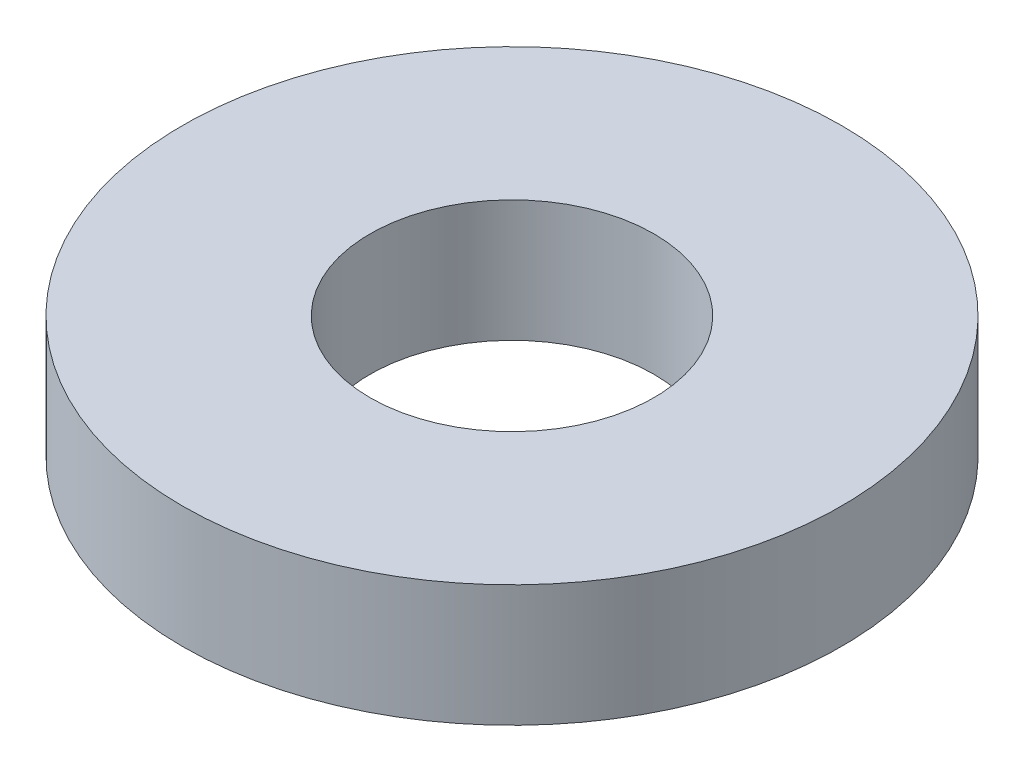
ISO-10303-21;
HEADER;
FILE_DESCRIPTION(('STEP AP214'),'2;1');
FILE_NAME('part.step','',(''),(''),'','','');
FILE_SCHEMA(('AUTOMOTIVE_DESIGN { 1 0 10303 214 1 1 1 1 }'));
ENDSEC;
DATA;
#1=APPLICATION_CONTEXT('core data for automotive mechanical design processes');
#2=APPLICATION_PROTOCOL_DEFINITION('international standard','automotive_design',2000,#1);
#3=PRODUCT_CONTEXT('',#1,'mechanical');
#4=PRODUCT('Part','Part','',(#3));
#5=PRODUCT_RELATED_PRODUCT_CATEGORY('part','',(#4));
#6=PRODUCT_DEFINITION_FORMATION('','',#4);
#7=PRODUCT_DEFINITION_CONTEXT('part definition',#1,'design');
#8=PRODUCT_DEFINITION('design','',#6,#7);
#9=PRODUCT_DEFINITION_SHAPE('','',#8);
#10=(LENGTH_UNIT() NAMED_UNIT(*) SI_UNIT(.MILLI.,.METRE.));
#11=(NAMED_UNIT(*) PLANE_ANGLE_UNIT() SI_UNIT($,.RADIAN.));
#12=(NAMED_UNIT(*) SI_UNIT($,.STERADIAN.) SOLID_ANGLE_UNIT());
#13=UNCERTAINTY_MEASURE_WITH_UNIT(LENGTH_MEASURE(1.E-05),#10,'distance_accuracy_value','');
#14=(GEOMETRIC_REPRESENTATION_CONTEXT(3) GLOBAL_UNCERTAINTY_ASSIGNED_CONTEXT((#13)) GLOBAL_UNIT_ASSIGNED_CONTEXT((#10,
#11,#12)) REPRESENTATION_CONTEXT('',''));
#15=CARTESIAN_POINT('',(0.,0.,0.));
#16=DIRECTION('',(0.,0.,1.));
#17=DIRECTION('',(1.,0.,0.));
#18=AXIS2_PLACEMENT_3D('',#15,#16,#17);
#19=CARTESIAN_POINT('',(0.,12.,0.));
#20=DIRECTION('',(0.,1.,0.));
#21=DIRECTION('',(0.,0.,1.));
#22=AXIS2_PLACEMENT_3D('',#19,#20,#21);
#23=PLANE('',#22);
#24=CARTESIAN_POINT('',(0.,12.,0.));
#25=DIRECTION('',(0.,1.,0.));
#26=DIRECTION('',(0.,0.,1.));
#27=AXIS2_PLACEMENT_3D('',#24,#25,#26);
#28=CIRCLE('',#27,32.5);
#29=CARTESIAN_POINT('',(0.,12.,32.5));
#30=VERTEX_POINT('',#29);
#31=EDGE_CURVE('E10',#30,#30,#28,.T.);
#32=ORIENTED_EDGE('',*,*,#31,.T.);
#33=EDGE_LOOP('',(#32));
#34=FACE_BOUND('',#33,.T.);
#35=CARTESIAN_POINT('',(0.,12.,0.));
#36=DIRECTION('',(0.,1.,0.));
#37=DIRECTION('',(0.,0.,1.));
#38=AXIS2_PLACEMENT_3D('',#35,#36,#37);
#39=CIRCLE('',#38,14.);
#40=CARTESIAN_POINT('',(0.,12.,14.));
#41=VERTEX_POINT('',#40);
#42=EDGE_CURVE('E44',#41,#41,#39,.T.);
#43=ORIENTED_EDGE('',*,*,#42,.F.);
#44=EDGE_LOOP('',(#43));
#45=FACE_BOUND('',#44,.T.);
#46=ADVANCED_FACE('F33',(#34,#45),#23,.T.);
#47=CARTESIAN_POINT('',(0.,0.,0.));
#48=DIRECTION('',(0.,1.,0.));
#49=DIRECTION('',(0.,0.,1.));
#50=AXIS2_PLACEMENT_3D('',#47,#48,#49);
#51=PLANE('',#50);
#52=CARTESIAN_POINT('',(0.,0.,0.));
#53=DIRECTION('',(0.,1.,0.));
#54=DIRECTION('',(0.,0.,1.));
#55=AXIS2_PLACEMENT_3D('',#52,#53,#54);
#56=CIRCLE('',#55,32.5);
#57=CARTESIAN_POINT('',(0.,0.,32.5));
#58=VERTEX_POINT('',#57);
#59=EDGE_CURVE('E37',#58,#58,#56,.T.);
#60=ORIENTED_EDGE('',*,*,#59,.F.);
#61=EDGE_LOOP('',(#60));
#62=FACE_BOUND('',#61,.T.);
#63=CARTESIAN_POINT('',(0.,0.,0.));
#64=DIRECTION('',(0.,1.,0.));
#65=DIRECTION('',(0.,0.,1.));
#66=AXIS2_PLACEMENT_3D('',#63,#64,#65);
#67=CIRCLE('',#66,14.);
#68=CARTESIAN_POINT('',(0.,0.,14.));
#69=VERTEX_POINT('',#68);
#70=EDGE_CURVE('E46',#69,#69,#67,.T.);
#71=ORIENTED_EDGE('',*,*,#70,.T.);
#72=EDGE_LOOP('',(#71));
#73=FACE_BOUND('',#72,.T.);
#74=ADVANCED_FACE('F56',(#62,#73),#51,.F.);
#75=CARTESIAN_POINT('',(0.,12.,0.));
#76=DIRECTION('',(0.,-1.,0.));
#77=DIRECTION('',(0.,0.,-1.));
#78=AXIS2_PLACEMENT_3D('',#75,#76,#77);
#79=CYLINDRICAL_SURFACE('',#78,32.5);
#80=ORIENTED_EDGE('',*,*,#31,.F.);
#81=EDGE_LOOP('',(#80));
#82=FACE_BOUND('',#81,.T.);
#83=ORIENTED_EDGE('',*,*,#59,.T.);
#84=EDGE_LOOP('',(#83));
#85=FACE_BOUND('',#84,.T.);
#86=ADVANCED_FACE('F35',(#82,#85),#79,.T.);
#87=CARTESIAN_POINT('',(0.,12.,0.));
#88=DIRECTION('',(0.,-1.,0.));
#89=DIRECTION('',(0.,0.,-1.));
#90=AXIS2_PLACEMENT_3D('',#87,#88,#89);
#91=CYLINDRICAL_SURFACE('',#90,14.);
#92=ORIENTED_EDGE('',*,*,#42,.T.);
#93=EDGE_LOOP('',(#92));
#94=FACE_BOUND('',#93,.T.);
#95=ORIENTED_EDGE('',*,*,#70,.F.);
#96=EDGE_LOOP('',(#95));
#97=FACE_BOUND('',#96,.T.);
#98=ADVANCED_FACE('F52',(#94,#97),#91,.F.);
#99=CLOSED_SHELL('',(#46,#74,#86,#98));
#100=MANIFOLD_SOLID_BREP('B2',#99);
#101=ADVANCED_BREP_SHAPE_REPRESENTATION('',(#18,#100),#14);
#102=SHAPE_DEFINITION_REPRESENTATION(#9,#101);
ENDSEC;
END-ISO-10303-21;
